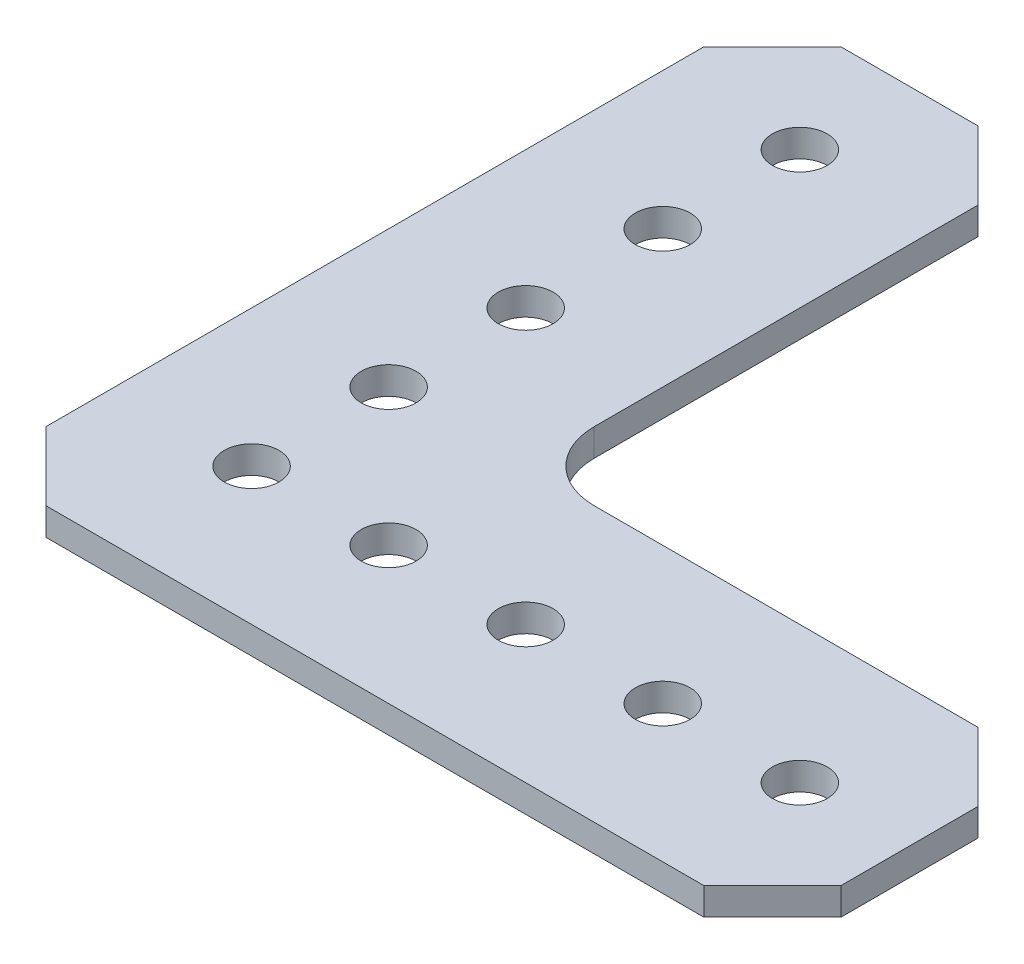
ISO-10303-21;
HEADER;
FILE_DESCRIPTION(('STEP AP214'),'2;1');
FILE_NAME('part.step','',(''),(''),'','','');
FILE_SCHEMA(('AUTOMOTIVE_DESIGN { 1 0 10303 214 1 1 1 1 }'));
ENDSEC;
DATA;
#1=APPLICATION_CONTEXT('core data for automotive mechanical design processes');
#2=APPLICATION_PROTOCOL_DEFINITION('international standard','automotive_design',2000,#1);
#3=PRODUCT_CONTEXT('',#1,'mechanical');
#4=PRODUCT('Part','Part','',(#3));
#5=PRODUCT_RELATED_PRODUCT_CATEGORY('part','',(#4));
#6=PRODUCT_DEFINITION_FORMATION('','',#4);
#7=PRODUCT_DEFINITION_CONTEXT('part definition',#1,'design');
#8=PRODUCT_DEFINITION('design','',#6,#7);
#9=PRODUCT_DEFINITION_SHAPE('','',#8);
#10=(LENGTH_UNIT() NAMED_UNIT(*) SI_UNIT(.MILLI.,.METRE.));
#11=(NAMED_UNIT(*) PLANE_ANGLE_UNIT() SI_UNIT($,.RADIAN.));
#12=(NAMED_UNIT(*) SI_UNIT($,.STERADIAN.) SOLID_ANGLE_UNIT());
#13=UNCERTAINTY_MEASURE_WITH_UNIT(LENGTH_MEASURE(1.E-05),#10,'distance_accuracy_value','');
#14=(GEOMETRIC_REPRESENTATION_CONTEXT(3) GLOBAL_UNCERTAINTY_ASSIGNED_CONTEXT((#13)) GLOBAL_UNIT_ASSIGNED_CONTEXT((#10,
#11,#12)) REPRESENTATION_CONTEXT('',''));
#15=CARTESIAN_POINT('',(0.,0.,0.));
#16=DIRECTION('',(0.,0.,1.));
#17=DIRECTION('',(1.,0.,0.));
#18=AXIS2_PLACEMENT_3D('',#15,#16,#17);
#19=CARTESIAN_POINT('',(-10.,2.,58.));
#20=DIRECTION('',(0.,0.,-1.));
#21=DIRECTION('',(-1.,0.,0.));
#22=AXIS2_PLACEMENT_3D('',#19,#20,#21);
#23=PLANE('',#22);
#24=DIRECTION('',(1.,0.,0.));
#25=VECTOR('',#24,1.);
#26=CARTESIAN_POINT('',(-10.,0.,58.));
#27=LINE('',#26,#25);
#28=CARTESIAN_POINT('',(-5.,0.,58.));
#29=VERTEX_POINT('',#28);
#30=CARTESIAN_POINT('',(43.,0.,58.));
#31=VERTEX_POINT('',#30);
#32=EDGE_CURVE('E257',#29,#31,#27,.T.);
#33=ORIENTED_EDGE('',*,*,#32,.T.);
#34=DIRECTION('',(0.,1.,0.));
#35=VECTOR('',#34,1.);
#36=CARTESIAN_POINT('',(43.,2.,58.));
#37=LINE('',#36,#35);
#38=CARTESIAN_POINT('',(43.,2.,58.));
#39=VERTEX_POINT('',#38);
#40=EDGE_CURVE('E226',#31,#39,#37,.T.);
#41=ORIENTED_EDGE('',*,*,#40,.T.);
#42=DIRECTION('',(1.,0.,0.));
#43=VECTOR('',#42,1.);
#44=CARTESIAN_POINT('',(-10.,2.,58.));
#45=LINE('',#44,#43);
#46=CARTESIAN_POINT('',(-5.,2.,58.));
#47=VERTEX_POINT('',#46);
#48=EDGE_CURVE('E177',#47,#39,#45,.T.);
#49=ORIENTED_EDGE('',*,*,#48,.F.);
#50=DIRECTION('',(0.,-1.,0.));
#51=VECTOR('',#50,1.);
#52=CARTESIAN_POINT('',(-5.,2.,58.));
#53=LINE('',#52,#51);
#54=EDGE_CURVE('E222',#47,#29,#53,.T.);
#55=ORIENTED_EDGE('',*,*,#54,.T.);
#56=EDGE_LOOP('',(#33,#41,#49,#55));
#57=FACE_BOUND('',#56,.T.);
#58=ADVANCED_FACE('F43',(#57),#23,.F.);
#59=CARTESIAN_POINT('',(48.,2.,38.));
#60=DIRECTION('',(-1.,0.,0.));
#61=DIRECTION('',(0.,0.,1.));
#62=AXIS2_PLACEMENT_3D('',#59,#60,#61);
#63=PLANE('',#62);
#64=DIRECTION('',(0.,0.,-1.));
#65=VECTOR('',#64,1.);
#66=CARTESIAN_POINT('',(48.,0.,38.));
#67=LINE('',#66,#65);
#68=CARTESIAN_POINT('',(48.,0.,53.));
#69=VERTEX_POINT('',#68);
#70=CARTESIAN_POINT('',(48.,0.,43.));
#71=VERTEX_POINT('',#70);
#72=EDGE_CURVE('E172',#69,#71,#67,.T.);
#73=ORIENTED_EDGE('',*,*,#72,.T.);
#74=DIRECTION('',(0.,1.,0.));
#75=VECTOR('',#74,1.);
#76=CARTESIAN_POINT('',(48.,2.,43.));
#77=LINE('',#76,#75);
#78=CARTESIAN_POINT('',(48.,2.,43.));
#79=VERTEX_POINT('',#78);
#80=EDGE_CURVE('E205',#71,#79,#77,.T.);
#81=ORIENTED_EDGE('',*,*,#80,.T.);
#82=DIRECTION('',(0.,0.,-1.));
#83=VECTOR('',#82,1.);
#84=CARTESIAN_POINT('',(48.,2.,38.));
#85=LINE('',#84,#83);
#86=CARTESIAN_POINT('',(48.,2.,53.));
#87=VERTEX_POINT('',#86);
#88=EDGE_CURVE('E268',#87,#79,#85,.T.);
#89=ORIENTED_EDGE('',*,*,#88,.F.);
#90=DIRECTION('',(0.,-1.,0.));
#91=VECTOR('',#90,1.);
#92=CARTESIAN_POINT('',(48.,2.,53.));
#93=LINE('',#92,#91);
#94=EDGE_CURVE('E201',#87,#69,#93,.T.);
#95=ORIENTED_EDGE('',*,*,#94,.T.);
#96=EDGE_LOOP('',(#73,#81,#89,#95));
#97=FACE_BOUND('',#96,.T.);
#98=ADVANCED_FACE('F289',(#97),#63,.F.);
#99=CARTESIAN_POINT('',(10.,2.,38.));
#100=DIRECTION('',(0.,0.,1.));
#101=DIRECTION('',(1.,0.,0.));
#102=AXIS2_PLACEMENT_3D('',#99,#100,#101);
#103=PLANE('',#102);
#104=DIRECTION('',(-1.,0.,0.));
#105=VECTOR('',#104,1.);
#106=CARTESIAN_POINT('',(10.,2.,38.));
#107=LINE('',#106,#105);
#108=CARTESIAN_POINT('',(43.,2.,38.));
#109=VERTEX_POINT('',#108);
#110=CARTESIAN_POINT('',(15.,2.,38.));
#111=VERTEX_POINT('',#110);
#112=EDGE_CURVE('E271',#109,#111,#107,.T.);
#113=ORIENTED_EDGE('',*,*,#112,.F.);
#114=DIRECTION('',(0.,-1.,0.));
#115=VECTOR('',#114,1.);
#116=CARTESIAN_POINT('',(43.,2.,38.));
#117=LINE('',#116,#115);
#118=CARTESIAN_POINT('',(43.,0.,38.));
#119=VERTEX_POINT('',#118);
#120=EDGE_CURVE('E183',#109,#119,#117,.T.);
#121=ORIENTED_EDGE('',*,*,#120,.T.);
#122=DIRECTION('',(-1.,0.,0.));
#123=VECTOR('',#122,1.);
#124=CARTESIAN_POINT('',(10.,0.,38.));
#125=LINE('',#124,#123);
#126=CARTESIAN_POINT('',(15.,0.,38.));
#127=VERTEX_POINT('',#126);
#128=EDGE_CURVE('E165',#119,#127,#125,.T.);
#129=ORIENTED_EDGE('',*,*,#128,.T.);
#130=DIRECTION('',(0.,-1.,0.));
#131=VECTOR('',#130,1.);
#132=CARTESIAN_POINT('',(15.,2.,38.));
#133=LINE('',#132,#131);
#134=EDGE_CURVE('E142',#127,#111,#133,.F.);
#135=ORIENTED_EDGE('',*,*,#134,.T.);
#136=EDGE_LOOP('',(#113,#121,#129,#135));
#137=FACE_BOUND('',#136,.T.);
#138=ADVANCED_FACE('F298',(#137),#103,.F.);
#139=CARTESIAN_POINT('',(10.,2.,0.));
#140=DIRECTION('',(-1.,0.,0.));
#141=DIRECTION('',(0.,0.,1.));
#142=AXIS2_PLACEMENT_3D('',#139,#140,#141);
#143=PLANE('',#142);
#144=DIRECTION('',(0.,0.,-1.));
#145=VECTOR('',#144,1.);
#146=CARTESIAN_POINT('',(10.,0.,0.));
#147=LINE('',#146,#145);
#148=CARTESIAN_POINT('',(10.,0.,33.));
#149=VERTEX_POINT('',#148);
#150=CARTESIAN_POINT('',(10.,0.,5.00000000000002));
#151=VERTEX_POINT('',#150);
#152=EDGE_CURVE('E153',#149,#151,#147,.T.);
#153=ORIENTED_EDGE('',*,*,#152,.T.);
#154=DIRECTION('',(0.,1.,0.));
#155=VECTOR('',#154,1.);
#156=CARTESIAN_POINT('',(10.,2.,5.00000000000002));
#157=LINE('',#156,#155);
#158=CARTESIAN_POINT('',(10.,2.,5.00000000000002));
#159=VERTEX_POINT('',#158);
#160=EDGE_CURVE('E11',#151,#159,#157,.T.);
#161=ORIENTED_EDGE('',*,*,#160,.T.);
#162=DIRECTION('',(0.,0.,-1.));
#163=VECTOR('',#162,1.);
#164=CARTESIAN_POINT('',(10.,2.,0.));
#165=LINE('',#164,#163);
#166=CARTESIAN_POINT('',(10.,2.,33.));
#167=VERTEX_POINT('',#166);
#168=EDGE_CURVE('E156',#167,#159,#165,.T.);
#169=ORIENTED_EDGE('',*,*,#168,.F.);
#170=DIRECTION('',(0.,-1.,0.));
#171=VECTOR('',#170,1.);
#172=CARTESIAN_POINT('',(10.,0.,33.));
#173=LINE('',#172,#171);
#174=EDGE_CURVE('E140',#167,#149,#173,.T.);
#175=ORIENTED_EDGE('',*,*,#174,.T.);
#176=EDGE_LOOP('',(#153,#161,#169,#175));
#177=FACE_BOUND('',#176,.T.);
#178=ADVANCED_FACE('F152',(#177),#143,.F.);
#179=CARTESIAN_POINT('',(-10.,2.,0.));
#180=DIRECTION('',(0.,0.,1.));
#181=DIRECTION('',(1.,0.,0.));
#182=AXIS2_PLACEMENT_3D('',#179,#180,#181);
#183=PLANE('',#182);
#184=DIRECTION('',(-1.,0.,0.));
#185=VECTOR('',#184,1.);
#186=CARTESIAN_POINT('',(-10.,0.,0.));
#187=LINE('',#186,#185);
#188=CARTESIAN_POINT('',(5.,0.,0.));
#189=VERTEX_POINT('',#188);
#190=CARTESIAN_POINT('',(-4.99999999999999,0.,0.));
#191=VERTEX_POINT('',#190);
#192=EDGE_CURVE('E164',#189,#191,#187,.T.);
#193=ORIENTED_EDGE('',*,*,#192,.T.);
#194=DIRECTION('',(0.,1.,0.));
#195=VECTOR('',#194,1.);
#196=CARTESIAN_POINT('',(-4.99999999999999,2.,0.));
#197=LINE('',#196,#195);
#198=CARTESIAN_POINT('',(-4.99999999999999,2.,0.));
#199=VERTEX_POINT('',#198);
#200=EDGE_CURVE('E53',#191,#199,#197,.T.);
#201=ORIENTED_EDGE('',*,*,#200,.T.);
#202=DIRECTION('',(-1.,0.,0.));
#203=VECTOR('',#202,1.);
#204=CARTESIAN_POINT('',(-10.,2.,0.));
#205=LINE('',#204,#203);
#206=CARTESIAN_POINT('',(5.,2.,0.));
#207=VERTEX_POINT('',#206);
#208=EDGE_CURVE('E243',#207,#199,#205,.T.);
#209=ORIENTED_EDGE('',*,*,#208,.F.);
#210=DIRECTION('',(0.,-1.,0.));
#211=VECTOR('',#210,1.);
#212=CARTESIAN_POINT('',(5.,2.,0.));
#213=LINE('',#212,#211);
#214=EDGE_CURVE('E235',#207,#189,#213,.T.);
#215=ORIENTED_EDGE('',*,*,#214,.T.);
#216=EDGE_LOOP('',(#193,#201,#209,#215));
#217=FACE_BOUND('',#216,.T.);
#218=ADVANCED_FACE('F242',(#217),#183,.F.);
#219=CARTESIAN_POINT('',(-10.,2.,0.));
#220=DIRECTION('',(1.,0.,0.));
#221=DIRECTION('',(0.,0.,-1.));
#222=AXIS2_PLACEMENT_3D('',#219,#220,#221);
#223=PLANE('',#222);
#224=DIRECTION('',(0.,0.,1.));
#225=VECTOR('',#224,1.);
#226=CARTESIAN_POINT('',(-10.,0.,0.));
#227=LINE('',#226,#225);
#228=CARTESIAN_POINT('',(-10.,0.,4.99999999999999));
#229=VERTEX_POINT('',#228);
#230=CARTESIAN_POINT('',(-10.,0.,53.));
#231=VERTEX_POINT('',#230);
#232=EDGE_CURVE('E170',#229,#231,#227,.T.);
#233=ORIENTED_EDGE('',*,*,#232,.T.);
#234=DIRECTION('',(0.,1.,0.));
#235=VECTOR('',#234,1.);
#236=CARTESIAN_POINT('',(-10.,2.,53.));
#237=LINE('',#236,#235);
#238=CARTESIAN_POINT('',(-10.,2.,53.));
#239=VERTEX_POINT('',#238);
#240=EDGE_CURVE('E60',#231,#239,#237,.T.);
#241=ORIENTED_EDGE('',*,*,#240,.T.);
#242=DIRECTION('',(0.,0.,1.));
#243=VECTOR('',#242,1.);
#244=CARTESIAN_POINT('',(-10.,2.,0.));
#245=LINE('',#244,#243);
#246=CARTESIAN_POINT('',(-10.,2.,4.99999999999999));
#247=VERTEX_POINT('',#246);
#248=EDGE_CURVE('E158',#247,#239,#245,.T.);
#249=ORIENTED_EDGE('',*,*,#248,.F.);
#250=DIRECTION('',(0.,-1.,0.));
#251=VECTOR('',#250,1.);
#252=CARTESIAN_POINT('',(-10.,2.,4.99999999999999));
#253=LINE('',#252,#251);
#254=EDGE_CURVE('E229',#247,#229,#253,.T.);
#255=ORIENTED_EDGE('',*,*,#254,.T.);
#256=EDGE_LOOP('',(#233,#241,#249,#255));
#257=FACE_BOUND('',#256,.T.);
#258=ADVANCED_FACE('F254',(#257),#223,.F.);
#259=CARTESIAN_POINT('',(0.,2.,0.));
#260=DIRECTION('',(0.,-1.,0.));
#261=DIRECTION('',(0.,0.,-1.));
#262=AXIS2_PLACEMENT_3D('',#259,#260,#261);
#263=PLANE('',#262);
#264=CARTESIAN_POINT('',(0.,2.,18.));
#265=DIRECTION('',(0.,-1.,0.));
#266=DIRECTION('',(0.,0.,-1.));
#267=AXIS2_PLACEMENT_3D('',#264,#265,#266);
#268=CIRCLE('',#267,2.);
#269=CARTESIAN_POINT('',(0.,2.,16.));
#270=VERTEX_POINT('',#269);
#271=EDGE_CURVE('E521',#270,#270,#268,.T.);
#272=ORIENTED_EDGE('',*,*,#271,.T.);
#273=EDGE_LOOP('',(#272));
#274=FACE_BOUND('',#273,.T.);
#275=CARTESIAN_POINT('',(10.,2.,48.));
#276=DIRECTION('',(0.,-1.,0.));
#277=DIRECTION('',(0.,0.,-1.));
#278=AXIS2_PLACEMENT_3D('',#275,#276,#277);
#279=CIRCLE('',#278,2.);
#280=CARTESIAN_POINT('',(10.,2.,46.));
#281=VERTEX_POINT('',#280);
#282=EDGE_CURVE('E525',#281,#281,#279,.T.);
#283=ORIENTED_EDGE('',*,*,#282,.T.);
#284=EDGE_LOOP('',(#283));
#285=FACE_BOUND('',#284,.T.);
#286=CARTESIAN_POINT('',(0.,2.,38.));
#287=DIRECTION('',(0.,-1.,0.));
#288=DIRECTION('',(0.,0.,-1.));
#289=AXIS2_PLACEMENT_3D('',#286,#287,#288);
#290=CIRCLE('',#289,2.);
#291=CARTESIAN_POINT('',(0.,2.,36.));
#292=VERTEX_POINT('',#291);
#293=EDGE_CURVE('E529',#292,#292,#290,.T.);
#294=ORIENTED_EDGE('',*,*,#293,.T.);
#295=EDGE_LOOP('',(#294));
#296=FACE_BOUND('',#295,.T.);
#297=CARTESIAN_POINT('',(30.,2.,48.));
#298=DIRECTION('',(0.,-1.,0.));
#299=DIRECTION('',(0.,0.,-1.));
#300=AXIS2_PLACEMENT_3D('',#297,#298,#299);
#301=CIRCLE('',#300,1.99999999999999);
#302=CARTESIAN_POINT('',(30.,2.,46.));
#303=VERTEX_POINT('',#302);
#304=EDGE_CURVE('E533',#303,#303,#301,.T.);
#305=ORIENTED_EDGE('',*,*,#304,.T.);
#306=EDGE_LOOP('',(#305));
#307=FACE_BOUND('',#306,.T.);
#308=CARTESIAN_POINT('',(0.,2.,28.));
#309=DIRECTION('',(0.,-1.,0.));
#310=DIRECTION('',(0.,0.,-1.));
#311=AXIS2_PLACEMENT_3D('',#308,#309,#310);
#312=CIRCLE('',#311,2.);
#313=CARTESIAN_POINT('',(0.,2.,26.));
#314=VERTEX_POINT('',#313);
#315=EDGE_CURVE('E537',#314,#314,#312,.T.);
#316=ORIENTED_EDGE('',*,*,#315,.T.);
#317=EDGE_LOOP('',(#316));
#318=FACE_BOUND('',#317,.T.);
#319=CARTESIAN_POINT('',(0.,2.,48.));
#320=DIRECTION('',(0.,-1.,0.));
#321=DIRECTION('',(0.,0.,-1.));
#322=AXIS2_PLACEMENT_3D('',#319,#320,#321);
#323=CIRCLE('',#322,2.);
#324=CARTESIAN_POINT('',(0.,2.,46.));
#325=VERTEX_POINT('',#324);
#326=EDGE_CURVE('E541',#325,#325,#323,.T.);
#327=ORIENTED_EDGE('',*,*,#326,.T.);
#328=EDGE_LOOP('',(#327));
#329=FACE_BOUND('',#328,.T.);
#330=CARTESIAN_POINT('',(20.,2.,48.));
#331=DIRECTION('',(0.,-1.,0.));
#332=DIRECTION('',(0.,0.,-1.));
#333=AXIS2_PLACEMENT_3D('',#330,#331,#332);
#334=CIRCLE('',#333,2.);
#335=CARTESIAN_POINT('',(20.,2.,46.));
#336=VERTEX_POINT('',#335);
#337=EDGE_CURVE('E545',#336,#336,#334,.T.);
#338=ORIENTED_EDGE('',*,*,#337,.T.);
#339=EDGE_LOOP('',(#338));
#340=FACE_BOUND('',#339,.T.);
#341=CARTESIAN_POINT('',(40.,2.,48.));
#342=DIRECTION('',(0.,-1.,0.));
#343=DIRECTION('',(0.,0.,-1.));
#344=AXIS2_PLACEMENT_3D('',#341,#342,#343);
#345=CIRCLE('',#344,1.99999999999999);
#346=CARTESIAN_POINT('',(40.,2.,46.));
#347=VERTEX_POINT('',#346);
#348=EDGE_CURVE('E549',#347,#347,#345,.T.);
#349=ORIENTED_EDGE('',*,*,#348,.T.);
#350=EDGE_LOOP('',(#349));
#351=FACE_BOUND('',#350,.T.);
#352=CARTESIAN_POINT('',(0.,2.,8.));
#353=DIRECTION('',(0.,-1.,0.));
#354=DIRECTION('',(0.,0.,-1.));
#355=AXIS2_PLACEMENT_3D('',#352,#353,#354);
#356=CIRCLE('',#355,2.);
#357=CARTESIAN_POINT('',(0.,2.,6.));
#358=VERTEX_POINT('',#357);
#359=EDGE_CURVE('E274',#358,#358,#356,.T.);
#360=ORIENTED_EDGE('',*,*,#359,.T.);
#361=EDGE_LOOP('',(#360));
#362=FACE_BOUND('',#361,.T.);
#363=ORIENTED_EDGE('',*,*,#88,.T.);
#364=DIRECTION('',(0.707106781186547,0.,0.707106781186548));
#365=VECTOR('',#364,1.);
#366=CARTESIAN_POINT('',(43.,2.,38.));
#367=LINE('',#366,#365);
#368=EDGE_CURVE('E219',#79,#109,#367,.F.);
#369=ORIENTED_EDGE('',*,*,#368,.T.);
#370=ORIENTED_EDGE('',*,*,#112,.T.);
#371=CARTESIAN_POINT('',(15.,2.,33.));
#372=DIRECTION('',(0.,-1.,0.));
#373=DIRECTION('',(0.,0.,-1.));
#374=AXIS2_PLACEMENT_3D('',#371,#372,#373);
#375=CIRCLE('',#374,5.);
#376=EDGE_CURVE('E147',#111,#167,#375,.T.);
#377=ORIENTED_EDGE('',*,*,#376,.T.);
#378=ORIENTED_EDGE('',*,*,#168,.T.);
#379=DIRECTION('',(0.707106781186546,0.,0.707106781186549));
#380=VECTOR('',#379,1.);
#381=CARTESIAN_POINT('',(5.,2.,0.));
#382=LINE('',#381,#380);
#383=EDGE_CURVE('E208',#159,#207,#382,.F.);
#384=ORIENTED_EDGE('',*,*,#383,.T.);
#385=ORIENTED_EDGE('',*,*,#208,.T.);
#386=DIRECTION('',(0.707106781186549,0.,-0.707106781186546));
#387=VECTOR('',#386,1.);
#388=CARTESIAN_POINT('',(-10.,2.,4.99999999999999));
#389=LINE('',#388,#387);
#390=EDGE_CURVE('E67',#199,#247,#389,.F.);
#391=ORIENTED_EDGE('',*,*,#390,.T.);
#392=ORIENTED_EDGE('',*,*,#248,.T.);
#393=DIRECTION('',(-0.707106781186546,0.,-0.707106781186549));
#394=VECTOR('',#393,1.);
#395=CARTESIAN_POINT('',(-5.,2.,58.));
#396=LINE('',#395,#394);
#397=EDGE_CURVE('E213',#239,#47,#396,.F.);
#398=ORIENTED_EDGE('',*,*,#397,.T.);
#399=ORIENTED_EDGE('',*,*,#48,.T.);
#400=DIRECTION('',(-0.707106781186549,0.,0.707106781186546));
#401=VECTOR('',#400,1.);
#402=CARTESIAN_POINT('',(48.,2.,53.));
#403=LINE('',#402,#401);
#404=EDGE_CURVE('E216',#39,#87,#403,.F.);
#405=ORIENTED_EDGE('',*,*,#404,.T.);
#406=EDGE_LOOP('',(#363,#369,#370,#377,#378,#384,#385,#391,#392,#398,#399,#405));
#407=FACE_BOUND('',#406,.T.);
#408=ADVANCED_FACE('F247',(#274,#285,#296,#307,#318,#329,#340,#351,#362,#407),#263,.F.);
#409=CARTESIAN_POINT('',(0.,0.,0.));
#410=DIRECTION('',(0.,-1.,0.));
#411=DIRECTION('',(0.,0.,-1.));
#412=AXIS2_PLACEMENT_3D('',#409,#410,#411);
#413=PLANE('',#412);
#414=CARTESIAN_POINT('',(0.,0.,18.));
#415=DIRECTION('',(0.,-1.,0.));
#416=DIRECTION('',(0.,0.,-1.));
#417=AXIS2_PLACEMENT_3D('',#414,#415,#416);
#418=CIRCLE('',#417,1.99999999999999);
#419=CARTESIAN_POINT('',(0.,0.,16.));
#420=VERTEX_POINT('',#419);
#421=EDGE_CURVE('E603',#420,#420,#418,.T.);
#422=ORIENTED_EDGE('',*,*,#421,.F.);
#423=EDGE_LOOP('',(#422));
#424=FACE_BOUND('',#423,.T.);
#425=CARTESIAN_POINT('',(10.,0.,48.));
#426=DIRECTION('',(0.,-1.,0.));
#427=DIRECTION('',(0.,0.,-1.));
#428=AXIS2_PLACEMENT_3D('',#425,#426,#427);
#429=CIRCLE('',#428,1.99999999999999);
#430=CARTESIAN_POINT('',(10.,0.,46.));
#431=VERTEX_POINT('',#430);
#432=EDGE_CURVE('E597',#431,#431,#429,.T.);
#433=ORIENTED_EDGE('',*,*,#432,.F.);
#434=EDGE_LOOP('',(#433));
#435=FACE_BOUND('',#434,.T.);
#436=CARTESIAN_POINT('',(0.,0.,38.));
#437=DIRECTION('',(0.,-1.,0.));
#438=DIRECTION('',(0.,0.,-1.));
#439=AXIS2_PLACEMENT_3D('',#436,#437,#438);
#440=CIRCLE('',#439,1.99999999999999);
#441=CARTESIAN_POINT('',(0.,0.,36.));
#442=VERTEX_POINT('',#441);
#443=EDGE_CURVE('E591',#442,#442,#440,.T.);
#444=ORIENTED_EDGE('',*,*,#443,.F.);
#445=EDGE_LOOP('',(#444));
#446=FACE_BOUND('',#445,.T.);
#447=CARTESIAN_POINT('',(30.,0.,48.));
#448=DIRECTION('',(0.,-1.,0.));
#449=DIRECTION('',(0.,0.,-1.));
#450=AXIS2_PLACEMENT_3D('',#447,#448,#449);
#451=CIRCLE('',#450,1.99999999999999);
#452=CARTESIAN_POINT('',(30.,0.,46.));
#453=VERTEX_POINT('',#452);
#454=EDGE_CURVE('E585',#453,#453,#451,.T.);
#455=ORIENTED_EDGE('',*,*,#454,.F.);
#456=EDGE_LOOP('',(#455));
#457=FACE_BOUND('',#456,.T.);
#458=CARTESIAN_POINT('',(0.,0.,28.));
#459=DIRECTION('',(0.,-1.,0.));
#460=DIRECTION('',(0.,0.,-1.));
#461=AXIS2_PLACEMENT_3D('',#458,#459,#460);
#462=CIRCLE('',#461,1.99999999999999);
#463=CARTESIAN_POINT('',(0.,0.,26.));
#464=VERTEX_POINT('',#463);
#465=EDGE_CURVE('E579',#464,#464,#462,.T.);
#466=ORIENTED_EDGE('',*,*,#465,.F.);
#467=EDGE_LOOP('',(#466));
#468=FACE_BOUND('',#467,.T.);
#469=CARTESIAN_POINT('',(0.,0.,48.));
#470=DIRECTION('',(0.,-1.,0.));
#471=DIRECTION('',(0.,0.,-1.));
#472=AXIS2_PLACEMENT_3D('',#469,#470,#471);
#473=CIRCLE('',#472,1.99999999999999);
#474=CARTESIAN_POINT('',(0.,0.,46.));
#475=VERTEX_POINT('',#474);
#476=EDGE_CURVE('E573',#475,#475,#473,.T.);
#477=ORIENTED_EDGE('',*,*,#476,.F.);
#478=EDGE_LOOP('',(#477));
#479=FACE_BOUND('',#478,.T.);
#480=CARTESIAN_POINT('',(20.,0.,48.));
#481=DIRECTION('',(0.,-1.,0.));
#482=DIRECTION('',(0.,0.,-1.));
#483=AXIS2_PLACEMENT_3D('',#480,#481,#482);
#484=CIRCLE('',#483,1.99999999999999);
#485=CARTESIAN_POINT('',(20.,0.,46.));
#486=VERTEX_POINT('',#485);
#487=EDGE_CURVE('E567',#486,#486,#484,.T.);
#488=ORIENTED_EDGE('',*,*,#487,.F.);
#489=EDGE_LOOP('',(#488));
#490=FACE_BOUND('',#489,.T.);
#491=CARTESIAN_POINT('',(40.,0.,48.));
#492=DIRECTION('',(0.,-1.,0.));
#493=DIRECTION('',(0.,0.,-1.));
#494=AXIS2_PLACEMENT_3D('',#491,#492,#493);
#495=CIRCLE('',#494,1.99999999999999);
#496=CARTESIAN_POINT('',(40.,0.,46.));
#497=VERTEX_POINT('',#496);
#498=EDGE_CURVE('E559',#497,#497,#495,.T.);
#499=ORIENTED_EDGE('',*,*,#498,.F.);
#500=EDGE_LOOP('',(#499));
#501=FACE_BOUND('',#500,.T.);
#502=CARTESIAN_POINT('',(0.,0.,8.));
#503=DIRECTION('',(0.,-1.,0.));
#504=DIRECTION('',(0.,0.,-1.));
#505=AXIS2_PLACEMENT_3D('',#502,#503,#504);
#506=CIRCLE('',#505,1.99999999999999);
#507=CARTESIAN_POINT('',(0.,0.,6.00000000000001));
#508=VERTEX_POINT('',#507);
#509=EDGE_CURVE('E553',#508,#508,#506,.T.);
#510=ORIENTED_EDGE('',*,*,#509,.F.);
#511=EDGE_LOOP('',(#510));
#512=FACE_BOUND('',#511,.T.);
#513=ORIENTED_EDGE('',*,*,#128,.F.);
#514=DIRECTION('',(-0.707106781186547,0.,-0.707106781186548));
#515=VECTOR('',#514,1.);
#516=CARTESIAN_POINT('',(2.50000000000004,0.,-2.50000000000003));
#517=LINE('',#516,#515);
#518=EDGE_CURVE('E198',#119,#71,#517,.F.);
#519=ORIENTED_EDGE('',*,*,#518,.T.);
#520=ORIENTED_EDGE('',*,*,#72,.F.);
#521=DIRECTION('',(0.707106781186549,0.,-0.707106781186546));
#522=VECTOR('',#521,1.);
#523=CARTESIAN_POINT('',(50.4999999999999,0.,50.5000000000002));
#524=LINE('',#523,#522);
#525=EDGE_CURVE('E195',#69,#31,#524,.F.);
#526=ORIENTED_EDGE('',*,*,#525,.T.);
#527=ORIENTED_EDGE('',*,*,#32,.F.);
#528=DIRECTION('',(0.707106781186546,0.,0.707106781186549));
#529=VECTOR('',#528,1.);
#530=CARTESIAN_POINT('',(-31.5,0.,31.4999999999999));
#531=LINE('',#530,#529);
#532=EDGE_CURVE('E192',#29,#231,#531,.F.);
#533=ORIENTED_EDGE('',*,*,#532,.T.);
#534=ORIENTED_EDGE('',*,*,#232,.F.);
#535=DIRECTION('',(-0.707106781186549,0.,0.707106781186546));
#536=VECTOR('',#535,1.);
#537=CARTESIAN_POINT('',(-2.49999999999998,0.,-2.49999999999999));
#538=LINE('',#537,#536);
#539=EDGE_CURVE('E189',#229,#191,#538,.F.);
#540=ORIENTED_EDGE('',*,*,#539,.T.);
#541=ORIENTED_EDGE('',*,*,#192,.F.);
#542=DIRECTION('',(-0.707106781186546,0.,-0.707106781186549));
#543=VECTOR('',#542,1.);
#544=CARTESIAN_POINT('',(2.50000000000001,0.,-2.5));
#545=LINE('',#544,#543);
#546=EDGE_CURVE('E162',#189,#151,#545,.F.);
#547=ORIENTED_EDGE('',*,*,#546,.T.);
#548=ORIENTED_EDGE('',*,*,#152,.F.);
#549=CARTESIAN_POINT('',(15.,0.,33.));
#550=DIRECTION('',(0.,-1.,0.));
#551=DIRECTION('',(0.,0.,-1.));
#552=AXIS2_PLACEMENT_3D('',#549,#550,#551);
#553=CIRCLE('',#552,5.);
#554=EDGE_CURVE('E136',#149,#127,#553,.F.);
#555=ORIENTED_EDGE('',*,*,#554,.T.);
#556=EDGE_LOOP('',(#513,#519,#520,#526,#527,#533,#534,#540,#541,#547,#548,#555));
#557=FACE_BOUND('',#556,.T.);
#558=ADVANCED_FACE('F160',(#424,#435,#446,#457,#468,#479,#490,#501,#512,#557),#413,.T.);
#559=CARTESIAN_POINT('',(0.,0.,8.));
#560=DIRECTION('',(0.,-1.,0.));
#561=DIRECTION('',(0.,0.,-1.));
#562=AXIS2_PLACEMENT_3D('',#559,#560,#561);
#563=CYLINDRICAL_SURFACE('',#562,1.99999999999999);
#564=ORIENTED_EDGE('',*,*,#359,.F.);
#565=EDGE_LOOP('',(#564));
#566=FACE_BOUND('',#565,.T.);
#567=ORIENTED_EDGE('',*,*,#509,.T.);
#568=EDGE_LOOP('',(#567));
#569=FACE_BOUND('',#568,.T.);
#570=ADVANCED_FACE('F438',(#566,#569),#563,.F.);
#571=CARTESIAN_POINT('',(40.,0.,48.));
#572=DIRECTION('',(0.,-1.,0.));
#573=DIRECTION('',(0.,0.,-1.));
#574=AXIS2_PLACEMENT_3D('',#571,#572,#573);
#575=CYLINDRICAL_SURFACE('',#574,1.99999999999999);
#576=ORIENTED_EDGE('',*,*,#348,.F.);
#577=EDGE_LOOP('',(#576));
#578=FACE_BOUND('',#577,.T.);
#579=ORIENTED_EDGE('',*,*,#498,.T.);
#580=EDGE_LOOP('',(#579));
#581=FACE_BOUND('',#580,.T.);
#582=ADVANCED_FACE('F429',(#578,#581),#575,.F.);
#583=CARTESIAN_POINT('',(20.,0.,48.));
#584=DIRECTION('',(0.,-1.,0.));
#585=DIRECTION('',(0.,0.,-1.));
#586=AXIS2_PLACEMENT_3D('',#583,#584,#585);
#587=CYLINDRICAL_SURFACE('',#586,1.99999999999999);
#588=ORIENTED_EDGE('',*,*,#337,.F.);
#589=EDGE_LOOP('',(#588));
#590=FACE_BOUND('',#589,.T.);
#591=ORIENTED_EDGE('',*,*,#487,.T.);
#592=EDGE_LOOP('',(#591));
#593=FACE_BOUND('',#592,.T.);
#594=ADVANCED_FACE('F420',(#590,#593),#587,.F.);
#595=CARTESIAN_POINT('',(0.,0.,48.));
#596=DIRECTION('',(0.,-1.,0.));
#597=DIRECTION('',(0.,0.,-1.));
#598=AXIS2_PLACEMENT_3D('',#595,#596,#597);
#599=CYLINDRICAL_SURFACE('',#598,1.99999999999999);
#600=ORIENTED_EDGE('',*,*,#326,.F.);
#601=EDGE_LOOP('',(#600));
#602=FACE_BOUND('',#601,.T.);
#603=ORIENTED_EDGE('',*,*,#476,.T.);
#604=EDGE_LOOP('',(#603));
#605=FACE_BOUND('',#604,.T.);
#606=ADVANCED_FACE('F411',(#602,#605),#599,.F.);
#607=CARTESIAN_POINT('',(0.,0.,28.));
#608=DIRECTION('',(0.,-1.,0.));
#609=DIRECTION('',(0.,0.,-1.));
#610=AXIS2_PLACEMENT_3D('',#607,#608,#609);
#611=CYLINDRICAL_SURFACE('',#610,1.99999999999999);
#612=ORIENTED_EDGE('',*,*,#315,.F.);
#613=EDGE_LOOP('',(#612));
#614=FACE_BOUND('',#613,.T.);
#615=ORIENTED_EDGE('',*,*,#465,.T.);
#616=EDGE_LOOP('',(#615));
#617=FACE_BOUND('',#616,.T.);
#618=ADVANCED_FACE('F402',(#614,#617),#611,.F.);
#619=CARTESIAN_POINT('',(30.,0.,48.));
#620=DIRECTION('',(0.,-1.,0.));
#621=DIRECTION('',(0.,0.,-1.));
#622=AXIS2_PLACEMENT_3D('',#619,#620,#621);
#623=CYLINDRICAL_SURFACE('',#622,1.99999999999999);
#624=ORIENTED_EDGE('',*,*,#304,.F.);
#625=EDGE_LOOP('',(#624));
#626=FACE_BOUND('',#625,.T.);
#627=ORIENTED_EDGE('',*,*,#454,.T.);
#628=EDGE_LOOP('',(#627));
#629=FACE_BOUND('',#628,.T.);
#630=ADVANCED_FACE('F393',(#626,#629),#623,.F.);
#631=CARTESIAN_POINT('',(0.,0.,38.));
#632=DIRECTION('',(0.,-1.,0.));
#633=DIRECTION('',(0.,0.,-1.));
#634=AXIS2_PLACEMENT_3D('',#631,#632,#633);
#635=CYLINDRICAL_SURFACE('',#634,1.99999999999999);
#636=ORIENTED_EDGE('',*,*,#293,.F.);
#637=EDGE_LOOP('',(#636));
#638=FACE_BOUND('',#637,.T.);
#639=ORIENTED_EDGE('',*,*,#443,.T.);
#640=EDGE_LOOP('',(#639));
#641=FACE_BOUND('',#640,.T.);
#642=ADVANCED_FACE('F384',(#638,#641),#635,.F.);
#643=CARTESIAN_POINT('',(10.,0.,48.));
#644=DIRECTION('',(0.,-1.,0.));
#645=DIRECTION('',(0.,0.,-1.));
#646=AXIS2_PLACEMENT_3D('',#643,#644,#645);
#647=CYLINDRICAL_SURFACE('',#646,1.99999999999999);
#648=ORIENTED_EDGE('',*,*,#282,.F.);
#649=EDGE_LOOP('',(#648));
#650=FACE_BOUND('',#649,.T.);
#651=ORIENTED_EDGE('',*,*,#432,.T.);
#652=EDGE_LOOP('',(#651));
#653=FACE_BOUND('',#652,.T.);
#654=ADVANCED_FACE('F375',(#650,#653),#647,.F.);
#655=CARTESIAN_POINT('',(0.,0.,18.));
#656=DIRECTION('',(0.,-1.,0.));
#657=DIRECTION('',(0.,0.,-1.));
#658=AXIS2_PLACEMENT_3D('',#655,#656,#657);
#659=CYLINDRICAL_SURFACE('',#658,1.99999999999999);
#660=ORIENTED_EDGE('',*,*,#271,.F.);
#661=EDGE_LOOP('',(#660));
#662=FACE_BOUND('',#661,.T.);
#663=ORIENTED_EDGE('',*,*,#421,.T.);
#664=EDGE_LOOP('',(#663));
#665=FACE_BOUND('',#664,.T.);
#666=ADVANCED_FACE('F314',(#662,#665),#659,.F.);
#667=CARTESIAN_POINT('',(15.,2.,33.));
#668=DIRECTION('',(0.,1.,0.));
#669=DIRECTION('',(0.,0.,1.));
#670=AXIS2_PLACEMENT_3D('',#667,#668,#669);
#671=CYLINDRICAL_SURFACE('',#670,5.);
#672=ORIENTED_EDGE('',*,*,#376,.F.);
#673=ORIENTED_EDGE('',*,*,#134,.F.);
#674=ORIENTED_EDGE('',*,*,#554,.F.);
#675=ORIENTED_EDGE('',*,*,#174,.F.);
#676=EDGE_LOOP('',(#672,#673,#674,#675));
#677=FACE_BOUND('',#676,.T.);
#678=ADVANCED_FACE('F139',(#677),#671,.F.);
#679=CARTESIAN_POINT('',(43.,2.,38.));
#680=DIRECTION('',(-0.707106781186548,0.,0.707106781186547));
#681=DIRECTION('',(0.,-1.,0.));
#682=AXIS2_PLACEMENT_3D('',#679,#680,#681);
#683=PLANE('',#682);
#684=ORIENTED_EDGE('',*,*,#368,.F.);
#685=ORIENTED_EDGE('',*,*,#80,.F.);
#686=ORIENTED_EDGE('',*,*,#518,.F.);
#687=ORIENTED_EDGE('',*,*,#120,.F.);
#688=EDGE_LOOP('',(#684,#685,#686,#687));
#689=FACE_BOUND('',#688,.T.);
#690=ADVANCED_FACE('F294',(#689),#683,.F.);
#691=CARTESIAN_POINT('',(48.,2.,53.));
#692=DIRECTION('',(-0.707106781186546,0.,-0.707106781186549));
#693=DIRECTION('',(0.,-1.,0.));
#694=AXIS2_PLACEMENT_3D('',#691,#692,#693);
#695=PLANE('',#694);
#696=ORIENTED_EDGE('',*,*,#404,.F.);
#697=ORIENTED_EDGE('',*,*,#40,.F.);
#698=ORIENTED_EDGE('',*,*,#525,.F.);
#699=ORIENTED_EDGE('',*,*,#94,.F.);
#700=EDGE_LOOP('',(#696,#697,#698,#699));
#701=FACE_BOUND('',#700,.T.);
#702=ADVANCED_FACE('F321',(#701),#695,.F.);
#703=CARTESIAN_POINT('',(-5.,2.,58.));
#704=DIRECTION('',(0.707106781186549,0.,-0.707106781186546));
#705=DIRECTION('',(0.,-1.,0.));
#706=AXIS2_PLACEMENT_3D('',#703,#704,#705);
#707=PLANE('',#706);
#708=ORIENTED_EDGE('',*,*,#397,.F.);
#709=ORIENTED_EDGE('',*,*,#240,.F.);
#710=ORIENTED_EDGE('',*,*,#532,.F.);
#711=ORIENTED_EDGE('',*,*,#54,.F.);
#712=EDGE_LOOP('',(#708,#709,#710,#711));
#713=FACE_BOUND('',#712,.T.);
#714=ADVANCED_FACE('F261',(#713),#707,.F.);
#715=CARTESIAN_POINT('',(-10.,2.,4.99999999999999));
#716=DIRECTION('',(0.707106781186546,0.,0.707106781186549));
#717=DIRECTION('',(0.,-1.,0.));
#718=AXIS2_PLACEMENT_3D('',#715,#716,#717);
#719=PLANE('',#718);
#720=ORIENTED_EDGE('',*,*,#390,.F.);
#721=ORIENTED_EDGE('',*,*,#200,.F.);
#722=ORIENTED_EDGE('',*,*,#539,.F.);
#723=ORIENTED_EDGE('',*,*,#254,.F.);
#724=EDGE_LOOP('',(#720,#721,#722,#723));
#725=FACE_BOUND('',#724,.T.);
#726=ADVANCED_FACE('F252',(#725),#719,.F.);
#727=CARTESIAN_POINT('',(5.,2.,0.));
#728=DIRECTION('',(-0.707106781186549,0.,0.707106781186546));
#729=DIRECTION('',(0.,-1.,0.));
#730=AXIS2_PLACEMENT_3D('',#727,#728,#729);
#731=PLANE('',#730);
#732=ORIENTED_EDGE('',*,*,#383,.F.);
#733=ORIENTED_EDGE('',*,*,#160,.F.);
#734=ORIENTED_EDGE('',*,*,#546,.F.);
#735=ORIENTED_EDGE('',*,*,#214,.F.);
#736=EDGE_LOOP('',(#732,#733,#734,#735));
#737=FACE_BOUND('',#736,.T.);
#738=ADVANCED_FACE('F46',(#737),#731,.F.);
#739=CLOSED_SHELL('',(#58,#98,#138,#178,#218,#258,#408,#558,#570,#582,#594,#606,#618,#630,#642,
#654,#666,#678,#690,#702,#714,#726,#738));
#740=MANIFOLD_SOLID_BREP('B2',#739);
#741=ADVANCED_BREP_SHAPE_REPRESENTATION('',(#18,#740),#14);
#742=SHAPE_DEFINITION_REPRESENTATION(#9,#741);
ENDSEC;
END-ISO-10303-21;
